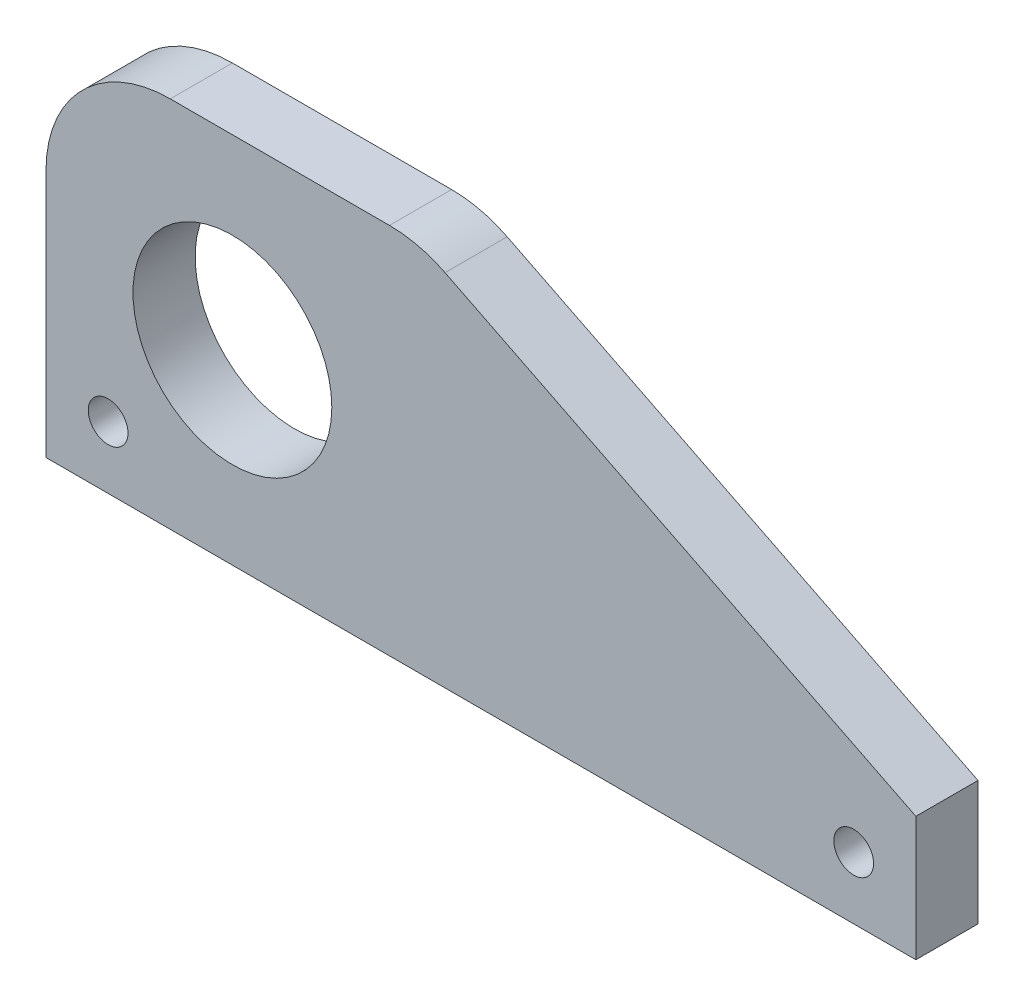
ISO-10303-21;
HEADER;
FILE_DESCRIPTION(('STEP AP214'),'2;1');
FILE_NAME('part.step','',(''),(''),'','','');
FILE_SCHEMA(('AUTOMOTIVE_DESIGN { 1 0 10303 214 1 1 1 1 }'));
ENDSEC;
DATA;
#1=APPLICATION_CONTEXT('core data for automotive mechanical design processes');
#2=APPLICATION_PROTOCOL_DEFINITION('international standard','automotive_design',2000,#1);
#3=PRODUCT_CONTEXT('',#1,'mechanical');
#4=PRODUCT('Part','Part','',(#3));
#5=PRODUCT_RELATED_PRODUCT_CATEGORY('part','',(#4));
#6=PRODUCT_DEFINITION_FORMATION('','',#4);
#7=PRODUCT_DEFINITION_CONTEXT('part definition',#1,'design');
#8=PRODUCT_DEFINITION('design','',#6,#7);
#9=PRODUCT_DEFINITION_SHAPE('','',#8);
#10=(LENGTH_UNIT() NAMED_UNIT(*) SI_UNIT(.MILLI.,.METRE.));
#11=(NAMED_UNIT(*) PLANE_ANGLE_UNIT() SI_UNIT($,.RADIAN.));
#12=(NAMED_UNIT(*) SI_UNIT($,.STERADIAN.) SOLID_ANGLE_UNIT());
#13=UNCERTAINTY_MEASURE_WITH_UNIT(LENGTH_MEASURE(1.E-05),#10,'distance_accuracy_value','');
#14=(GEOMETRIC_REPRESENTATION_CONTEXT(3) GLOBAL_UNCERTAINTY_ASSIGNED_CONTEXT((#13)) GLOBAL_UNIT_ASSIGNED_CONTEXT((#10,
#11,#12)) REPRESENTATION_CONTEXT('',''));
#15=CARTESIAN_POINT('',(0.,0.,0.));
#16=DIRECTION('',(0.,0.,1.));
#17=DIRECTION('',(1.,0.,0.));
#18=AXIS2_PLACEMENT_3D('',#15,#16,#17);
#19=CARTESIAN_POINT('',(0.,0.,5.));
#20=DIRECTION('',(0.,0.,-1.));
#21=DIRECTION('',(-1.,0.,0.));
#22=AXIS2_PLACEMENT_3D('',#19,#20,#21);
#23=PLANE('',#22);
#24=DIRECTION('',(-0.894427190999916,0.447213595499958,0.));
#25=VECTOR('',#24,1.);
#26=CARTESIAN_POINT('',(30.,30.,5.));
#27=LINE('',#26,#25);
#28=CARTESIAN_POINT('',(70.,10.,5.));
#29=VERTEX_POINT('',#28);
#30=CARTESIAN_POINT('',(32.1114561800017,28.9442719099992,5.));
#31=VERTEX_POINT('',#30);
#32=EDGE_CURVE('E103',#29,#31,#27,.T.);
#33=ORIENTED_EDGE('',*,*,#32,.T.);
#34=CARTESIAN_POINT('',(27.6393202250021,20.,5.));
#35=DIRECTION('',(0.,0.,-1.));
#36=DIRECTION('',(-1.,0.,0.));
#37=AXIS2_PLACEMENT_3D('',#34,#35,#36);
#38=CIRCLE('',#37,10.);
#39=CARTESIAN_POINT('',(27.6393202250021,30.,5.));
#40=VERTEX_POINT('',#39);
#41=EDGE_CURVE('E41',#31,#40,#38,.F.);
#42=ORIENTED_EDGE('',*,*,#41,.T.);
#43=DIRECTION('',(-1.,0.,0.));
#44=VECTOR('',#43,1.);
#45=CARTESIAN_POINT('',(0.,30.,5.));
#46=LINE('',#45,#44);
#47=CARTESIAN_POINT('',(10.,30.,5.));
#48=VERTEX_POINT('',#47);
#49=EDGE_CURVE('E134',#40,#48,#46,.T.);
#50=ORIENTED_EDGE('',*,*,#49,.T.);
#51=CARTESIAN_POINT('',(10.,20.,5.));
#52=DIRECTION('',(0.,0.,-1.));
#53=DIRECTION('',(-1.,0.,0.));
#54=AXIS2_PLACEMENT_3D('',#51,#52,#53);
#55=CIRCLE('',#54,10.);
#56=CARTESIAN_POINT('',(0.,20.,5.));
#57=VERTEX_POINT('',#56);
#58=EDGE_CURVE('E48',#48,#57,#55,.F.);
#59=ORIENTED_EDGE('',*,*,#58,.T.);
#60=DIRECTION('',(0.,-1.,0.));
#61=VECTOR('',#60,1.);
#62=CARTESIAN_POINT('',(0.,10.,5.));
#63=LINE('',#62,#61);
#64=CARTESIAN_POINT('',(0.,0.,5.));
#65=VERTEX_POINT('',#64);
#66=EDGE_CURVE('E108',#57,#65,#63,.T.);
#67=ORIENTED_EDGE('',*,*,#66,.T.);
#68=DIRECTION('',(1.,0.,0.));
#69=VECTOR('',#68,1.);
#70=CARTESIAN_POINT('',(70.,0.,5.));
#71=LINE('',#70,#69);
#72=CARTESIAN_POINT('',(70.,0.,5.));
#73=VERTEX_POINT('',#72);
#74=EDGE_CURVE('E104',#65,#73,#71,.T.);
#75=ORIENTED_EDGE('',*,*,#74,.T.);
#76=DIRECTION('',(0.,1.,0.));
#77=VECTOR('',#76,1.);
#78=CARTESIAN_POINT('',(70.,10.,5.));
#79=LINE('',#78,#77);
#80=EDGE_CURVE('E95',#73,#29,#79,.T.);
#81=ORIENTED_EDGE('',*,*,#80,.T.);
#82=EDGE_LOOP('',(#33,#42,#50,#59,#67,#75,#81));
#83=FACE_BOUND('',#82,.T.);
#84=CARTESIAN_POINT('',(15.,15.,5.));
#85=DIRECTION('',(0.,0.,1.));
#86=DIRECTION('',(1.,0.,0.));
#87=AXIS2_PLACEMENT_3D('',#84,#85,#86);
#88=CIRCLE('',#87,8.);
#89=CARTESIAN_POINT('',(23.,15.,5.));
#90=VERTEX_POINT('',#89);
#91=EDGE_CURVE('E159',#90,#90,#88,.T.);
#92=ORIENTED_EDGE('',*,*,#91,.F.);
#93=EDGE_LOOP('',(#92));
#94=FACE_BOUND('',#93,.T.);
#95=CARTESIAN_POINT('',(5.,4.99999999999999,5.));
#96=DIRECTION('',(0.,0.,1.));
#97=DIRECTION('',(1.,0.,0.));
#98=AXIS2_PLACEMENT_3D('',#95,#96,#97);
#99=CIRCLE('',#98,1.6);
#100=CARTESIAN_POINT('',(6.60000000000001,4.99999999999999,5.));
#101=VERTEX_POINT('',#100);
#102=EDGE_CURVE('E166',#101,#101,#99,.T.);
#103=ORIENTED_EDGE('',*,*,#102,.F.);
#104=EDGE_LOOP('',(#103));
#105=FACE_BOUND('',#104,.T.);
#106=CARTESIAN_POINT('',(65.,5.,5.));
#107=DIRECTION('',(0.,0.,1.));
#108=DIRECTION('',(1.,0.,0.));
#109=AXIS2_PLACEMENT_3D('',#106,#107,#108);
#110=CIRCLE('',#109,1.60000000000001);
#111=CARTESIAN_POINT('',(66.6,5.,5.));
#112=VERTEX_POINT('',#111);
#113=EDGE_CURVE('E172',#112,#112,#110,.T.);
#114=ORIENTED_EDGE('',*,*,#113,.F.);
#115=EDGE_LOOP('',(#114));
#116=FACE_BOUND('',#115,.T.);
#117=ADVANCED_FACE('F33',(#83,#94,#105,#116),#23,.F.);
#118=CARTESIAN_POINT('',(0.,0.,0.));
#119=DIRECTION('',(0.,0.,-1.));
#120=DIRECTION('',(-1.,0.,0.));
#121=AXIS2_PLACEMENT_3D('',#118,#119,#120);
#122=PLANE('',#121);
#123=CARTESIAN_POINT('',(5.,4.99999999999999,0.));
#124=DIRECTION('',(0.,0.,1.));
#125=DIRECTION('',(1.,0.,0.));
#126=AXIS2_PLACEMENT_3D('',#123,#124,#125);
#127=CIRCLE('',#126,1.6);
#128=CARTESIAN_POINT('',(6.60000000000001,4.99999999999999,0.));
#129=VERTEX_POINT('',#128);
#130=EDGE_CURVE('E169',#129,#129,#127,.T.);
#131=ORIENTED_EDGE('',*,*,#130,.T.);
#132=EDGE_LOOP('',(#131));
#133=FACE_BOUND('',#132,.T.);
#134=DIRECTION('',(-1.,0.,0.));
#135=VECTOR('',#134,1.);
#136=CARTESIAN_POINT('',(0.,30.,0.));
#137=LINE('',#136,#135);
#138=CARTESIAN_POINT('',(27.6393202250021,30.,0.));
#139=VERTEX_POINT('',#138);
#140=CARTESIAN_POINT('',(10.,30.,0.));
#141=VERTEX_POINT('',#140);
#142=EDGE_CURVE('E149',#139,#141,#137,.T.);
#143=ORIENTED_EDGE('',*,*,#142,.F.);
#144=CARTESIAN_POINT('',(27.6393202250021,20.,0.));
#145=DIRECTION('',(0.,0.,-1.));
#146=DIRECTION('',(-1.,0.,0.));
#147=AXIS2_PLACEMENT_3D('',#144,#145,#146);
#148=CIRCLE('',#147,10.);
#149=CARTESIAN_POINT('',(32.1114561800017,28.9442719099992,0.));
#150=VERTEX_POINT('',#149);
#151=EDGE_CURVE('E129',#139,#150,#148,.T.);
#152=ORIENTED_EDGE('',*,*,#151,.T.);
#153=DIRECTION('',(-0.894427190999916,0.447213595499958,0.));
#154=VECTOR('',#153,1.);
#155=CARTESIAN_POINT('',(30.,30.,0.));
#156=LINE('',#155,#154);
#157=CARTESIAN_POINT('',(70.,10.,0.));
#158=VERTEX_POINT('',#157);
#159=EDGE_CURVE('E148',#158,#150,#156,.T.);
#160=ORIENTED_EDGE('',*,*,#159,.F.);
#161=DIRECTION('',(0.,1.,0.));
#162=VECTOR('',#161,1.);
#163=CARTESIAN_POINT('',(70.,10.,0.));
#164=LINE('',#163,#162);
#165=CARTESIAN_POINT('',(70.,0.,0.));
#166=VERTEX_POINT('',#165);
#167=EDGE_CURVE('E151',#166,#158,#164,.T.);
#168=ORIENTED_EDGE('',*,*,#167,.F.);
#169=DIRECTION('',(1.,0.,0.));
#170=VECTOR('',#169,1.);
#171=CARTESIAN_POINT('',(70.,0.,0.));
#172=LINE('',#171,#170);
#173=CARTESIAN_POINT('',(0.,0.,0.));
#174=VERTEX_POINT('',#173);
#175=EDGE_CURVE('E116',#174,#166,#172,.T.);
#176=ORIENTED_EDGE('',*,*,#175,.F.);
#177=DIRECTION('',(0.,-1.,0.));
#178=VECTOR('',#177,1.);
#179=CARTESIAN_POINT('',(0.,0.,0.));
#180=LINE('',#179,#178);
#181=CARTESIAN_POINT('',(0.,20.,0.));
#182=VERTEX_POINT('',#181);
#183=EDGE_CURVE('E112',#182,#174,#180,.T.);
#184=ORIENTED_EDGE('',*,*,#183,.F.);
#185=CARTESIAN_POINT('',(10.,20.,0.));
#186=DIRECTION('',(0.,0.,-1.));
#187=DIRECTION('',(-1.,0.,0.));
#188=AXIS2_PLACEMENT_3D('',#185,#186,#187);
#189=CIRCLE('',#188,10.);
#190=EDGE_CURVE('E127',#182,#141,#189,.T.);
#191=ORIENTED_EDGE('',*,*,#190,.T.);
#192=EDGE_LOOP('',(#143,#152,#160,#168,#176,#184,#191));
#193=FACE_BOUND('',#192,.T.);
#194=CARTESIAN_POINT('',(15.,15.,0.));
#195=DIRECTION('',(0.,0.,1.));
#196=DIRECTION('',(1.,0.,0.));
#197=AXIS2_PLACEMENT_3D('',#194,#195,#196);
#198=CIRCLE('',#197,8.);
#199=CARTESIAN_POINT('',(23.,15.,0.));
#200=VERTEX_POINT('',#199);
#201=EDGE_CURVE('E161',#200,#200,#198,.T.);
#202=ORIENTED_EDGE('',*,*,#201,.T.);
#203=EDGE_LOOP('',(#202));
#204=FACE_BOUND('',#203,.T.);
#205=CARTESIAN_POINT('',(65.,5.,0.));
#206=DIRECTION('',(0.,0.,1.));
#207=DIRECTION('',(1.,0.,0.));
#208=AXIS2_PLACEMENT_3D('',#205,#206,#207);
#209=CIRCLE('',#208,1.60000000000001);
#210=CARTESIAN_POINT('',(66.6,5.,0.));
#211=VERTEX_POINT('',#210);
#212=EDGE_CURVE('E175',#211,#211,#209,.T.);
#213=ORIENTED_EDGE('',*,*,#212,.T.);
#214=EDGE_LOOP('',(#213));
#215=FACE_BOUND('',#214,.T.);
#216=ADVANCED_FACE('F146',(#133,#193,#204,#215),#122,.T.);
#217=CARTESIAN_POINT('',(70.,0.,5.));
#218=DIRECTION('',(0.,1.,0.));
#219=DIRECTION('',(-1.,0.,0.));
#220=AXIS2_PLACEMENT_3D('',#217,#218,#219);
#221=PLANE('',#220);
#222=ORIENTED_EDGE('',*,*,#175,.T.);
#223=DIRECTION('',(0.,0.,-1.));
#224=VECTOR('',#223,1.);
#225=CARTESIAN_POINT('',(70.,0.,5.));
#226=LINE('',#225,#224);
#227=EDGE_CURVE('E99',#73,#166,#226,.T.);
#228=ORIENTED_EDGE('',*,*,#227,.F.);
#229=ORIENTED_EDGE('',*,*,#74,.F.);
#230=DIRECTION('',(0.,0.,-1.));
#231=VECTOR('',#230,1.);
#232=CARTESIAN_POINT('',(0.,0.,5.));
#233=LINE('',#232,#231);
#234=EDGE_CURVE('E121',#65,#174,#233,.T.);
#235=ORIENTED_EDGE('',*,*,#234,.T.);
#236=EDGE_LOOP('',(#222,#228,#229,#235));
#237=FACE_BOUND('',#236,.T.);
#238=ADVANCED_FACE('F114',(#237),#221,.F.);
#239=CARTESIAN_POINT('',(70.,10.,5.));
#240=DIRECTION('',(-1.,0.,0.));
#241=DIRECTION('',(0.,0.,1.));
#242=AXIS2_PLACEMENT_3D('',#239,#240,#241);
#243=PLANE('',#242);
#244=ORIENTED_EDGE('',*,*,#167,.T.);
#245=DIRECTION('',(0.,0.,-1.));
#246=VECTOR('',#245,1.);
#247=CARTESIAN_POINT('',(70.,10.,5.));
#248=LINE('',#247,#246);
#249=EDGE_CURVE('E102',#29,#158,#248,.T.);
#250=ORIENTED_EDGE('',*,*,#249,.F.);
#251=ORIENTED_EDGE('',*,*,#80,.F.);
#252=ORIENTED_EDGE('',*,*,#227,.T.);
#253=EDGE_LOOP('',(#244,#250,#251,#252));
#254=FACE_BOUND('',#253,.T.);
#255=ADVANCED_FACE('F97',(#254),#243,.F.);
#256=CARTESIAN_POINT('',(30.,30.,5.));
#257=DIRECTION('',(-0.447213595499958,-0.894427190999916,0.));
#258=DIRECTION('',(0.894427190999916,-0.447213595499958,0.));
#259=AXIS2_PLACEMENT_3D('',#256,#257,#258);
#260=PLANE('',#259);
#261=ORIENTED_EDGE('',*,*,#159,.T.);
#262=DIRECTION('',(0.,0.,-1.));
#263=VECTOR('',#262,1.);
#264=CARTESIAN_POINT('',(32.1114561800017,28.9442719099992,5.));
#265=LINE('',#264,#263);
#266=EDGE_CURVE('E56',#150,#31,#265,.F.);
#267=ORIENTED_EDGE('',*,*,#266,.T.);
#268=ORIENTED_EDGE('',*,*,#32,.F.);
#269=ORIENTED_EDGE('',*,*,#249,.T.);
#270=EDGE_LOOP('',(#261,#267,#268,#269));
#271=FACE_BOUND('',#270,.T.);
#272=ADVANCED_FACE('F150',(#271),#260,.F.);
#273=CARTESIAN_POINT('',(0.,30.,5.));
#274=DIRECTION('',(0.,-1.,0.));
#275=DIRECTION('',(1.,0.,0.));
#276=AXIS2_PLACEMENT_3D('',#273,#274,#275);
#277=PLANE('',#276);
#278=ORIENTED_EDGE('',*,*,#49,.F.);
#279=DIRECTION('',(0.,0.,-1.));
#280=VECTOR('',#279,1.);
#281=CARTESIAN_POINT('',(27.6393202250021,30.,5.));
#282=LINE('',#281,#280);
#283=EDGE_CURVE('E119',#40,#139,#282,.T.);
#284=ORIENTED_EDGE('',*,*,#283,.T.);
#285=ORIENTED_EDGE('',*,*,#142,.T.);
#286=DIRECTION('',(0.,0.,-1.));
#287=VECTOR('',#286,1.);
#288=CARTESIAN_POINT('',(10.,30.,5.));
#289=LINE('',#288,#287);
#290=EDGE_CURVE('E117',#141,#48,#289,.F.);
#291=ORIENTED_EDGE('',*,*,#290,.T.);
#292=EDGE_LOOP('',(#278,#284,#285,#291));
#293=FACE_BOUND('',#292,.T.);
#294=ADVANCED_FACE('F138',(#293),#277,.F.);
#295=CARTESIAN_POINT('',(0.,0.,5.));
#296=DIRECTION('',(1.,0.,0.));
#297=DIRECTION('',(0.,0.,-1.));
#298=AXIS2_PLACEMENT_3D('',#295,#296,#297);
#299=PLANE('',#298);
#300=ORIENTED_EDGE('',*,*,#66,.F.);
#301=DIRECTION('',(0.,0.,-1.));
#302=VECTOR('',#301,1.);
#303=CARTESIAN_POINT('',(0.,20.,5.));
#304=LINE('',#303,#302);
#305=EDGE_CURVE('E11',#57,#182,#304,.T.);
#306=ORIENTED_EDGE('',*,*,#305,.T.);
#307=ORIENTED_EDGE('',*,*,#183,.T.);
#308=ORIENTED_EDGE('',*,*,#234,.F.);
#309=EDGE_LOOP('',(#300,#306,#307,#308));
#310=FACE_BOUND('',#309,.T.);
#311=ADVANCED_FACE('F195',(#310),#299,.F.);
#312=CARTESIAN_POINT('',(15.,15.,5.));
#313=DIRECTION('',(0.,0.,-1.));
#314=DIRECTION('',(-1.,0.,0.));
#315=AXIS2_PLACEMENT_3D('',#312,#313,#314);
#316=CYLINDRICAL_SURFACE('',#315,8.);
#317=ORIENTED_EDGE('',*,*,#91,.T.);
#318=EDGE_LOOP('',(#317));
#319=FACE_BOUND('',#318,.T.);
#320=ORIENTED_EDGE('',*,*,#201,.F.);
#321=EDGE_LOOP('',(#320));
#322=FACE_BOUND('',#321,.T.);
#323=ADVANCED_FACE('F192',(#319,#322),#316,.F.);
#324=CARTESIAN_POINT('',(5.,4.99999999999999,5.));
#325=DIRECTION('',(0.,0.,-1.));
#326=DIRECTION('',(-1.,0.,0.));
#327=AXIS2_PLACEMENT_3D('',#324,#325,#326);
#328=CYLINDRICAL_SURFACE('',#327,1.6);
#329=ORIENTED_EDGE('',*,*,#102,.T.);
#330=EDGE_LOOP('',(#329));
#331=FACE_BOUND('',#330,.T.);
#332=ORIENTED_EDGE('',*,*,#130,.F.);
#333=EDGE_LOOP('',(#332));
#334=FACE_BOUND('',#333,.T.);
#335=ADVANCED_FACE('F212',(#331,#334),#328,.F.);
#336=CARTESIAN_POINT('',(65.,5.,5.));
#337=DIRECTION('',(0.,0.,-1.));
#338=DIRECTION('',(-1.,0.,0.));
#339=AXIS2_PLACEMENT_3D('',#336,#337,#338);
#340=CYLINDRICAL_SURFACE('',#339,1.60000000000001);
#341=ORIENTED_EDGE('',*,*,#113,.T.);
#342=EDGE_LOOP('',(#341));
#343=FACE_BOUND('',#342,.T.);
#344=ORIENTED_EDGE('',*,*,#212,.F.);
#345=EDGE_LOOP('',(#344));
#346=FACE_BOUND('',#345,.T.);
#347=ADVANCED_FACE('F181',(#343,#346),#340,.F.);
#348=CARTESIAN_POINT('',(27.6393202250021,20.,5.));
#349=DIRECTION('',(0.,0.,-1.));
#350=DIRECTION('',(-1.,0.,0.));
#351=AXIS2_PLACEMENT_3D('',#348,#349,#350);
#352=CYLINDRICAL_SURFACE('',#351,10.);
#353=ORIENTED_EDGE('',*,*,#41,.F.);
#354=ORIENTED_EDGE('',*,*,#266,.F.);
#355=ORIENTED_EDGE('',*,*,#151,.F.);
#356=ORIENTED_EDGE('',*,*,#283,.F.);
#357=EDGE_LOOP('',(#353,#354,#355,#356));
#358=FACE_BOUND('',#357,.T.);
#359=ADVANCED_FACE('F143',(#358),#352,.T.);
#360=CARTESIAN_POINT('',(10.,20.,5.));
#361=DIRECTION('',(0.,0.,-1.));
#362=DIRECTION('',(-1.,0.,0.));
#363=AXIS2_PLACEMENT_3D('',#360,#361,#362);
#364=CYLINDRICAL_SURFACE('',#363,10.);
#365=ORIENTED_EDGE('',*,*,#58,.F.);
#366=ORIENTED_EDGE('',*,*,#290,.F.);
#367=ORIENTED_EDGE('',*,*,#190,.F.);
#368=ORIENTED_EDGE('',*,*,#305,.F.);
#369=EDGE_LOOP('',(#365,#366,#367,#368));
#370=FACE_BOUND('',#369,.T.);
#371=ADVANCED_FACE('F35',(#370),#364,.T.);
#372=CLOSED_SHELL('',(#117,#216,#238,#255,#272,#294,#311,#323,#335,#347,#359,#371));
#373=MANIFOLD_SOLID_BREP('B2',#372);
#374=ADVANCED_BREP_SHAPE_REPRESENTATION('',(#18,#373),#14);
#375=SHAPE_DEFINITION_REPRESENTATION(#9,#374);
ENDSEC;
END-ISO-10303-21;
